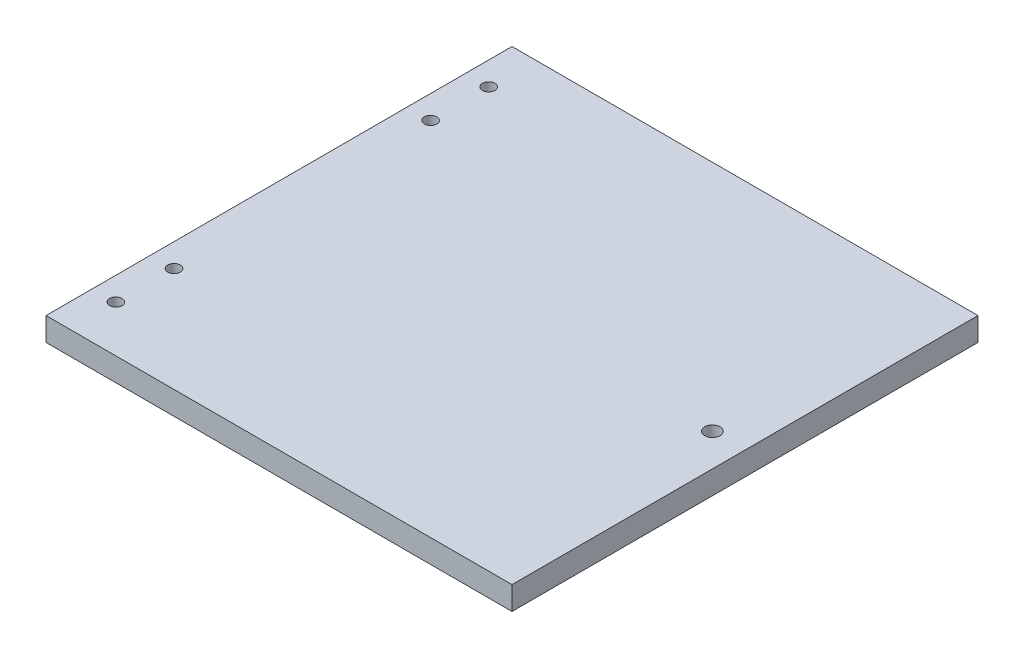
ISO-10303-21;
HEADER;
FILE_DESCRIPTION(('STEP AP214'),'2;1');
FILE_NAME('part.step','',(''),(''),'','','');
FILE_SCHEMA(('AUTOMOTIVE_DESIGN { 1 0 10303 214 1 1 1 1 }'));
ENDSEC;
DATA;
#1=APPLICATION_CONTEXT('core data for automotive mechanical design processes');
#2=APPLICATION_PROTOCOL_DEFINITION('international standard','automotive_design',2000,#1);
#3=PRODUCT_CONTEXT('',#1,'mechanical');
#4=PRODUCT('Part','Part','',(#3));
#5=PRODUCT_RELATED_PRODUCT_CATEGORY('part','',(#4));
#6=PRODUCT_DEFINITION_FORMATION('','',#4);
#7=PRODUCT_DEFINITION_CONTEXT('part definition',#1,'design');
#8=PRODUCT_DEFINITION('design','',#6,#7);
#9=PRODUCT_DEFINITION_SHAPE('','',#8);
#10=(LENGTH_UNIT() NAMED_UNIT(*) SI_UNIT(.MILLI.,.METRE.));
#11=(NAMED_UNIT(*) PLANE_ANGLE_UNIT() SI_UNIT($,.RADIAN.));
#12=(NAMED_UNIT(*) SI_UNIT($,.STERADIAN.) SOLID_ANGLE_UNIT());
#13=UNCERTAINTY_MEASURE_WITH_UNIT(LENGTH_MEASURE(1.E-05),#10,'distance_accuracy_value','');
#14=(GEOMETRIC_REPRESENTATION_CONTEXT(3) GLOBAL_UNCERTAINTY_ASSIGNED_CONTEXT((#13)) GLOBAL_UNIT_ASSIGNED_CONTEXT((#10,
#11,#12)) REPRESENTATION_CONTEXT('',''));
#15=CARTESIAN_POINT('',(0.,0.,0.));
#16=DIRECTION('',(0.,0.,1.));
#17=DIRECTION('',(1.,0.,0.));
#18=AXIS2_PLACEMENT_3D('',#15,#16,#17);
#19=CARTESIAN_POINT('',(0.,6.35,0.));
#20=DIRECTION('',(0.,1.,0.));
#21=DIRECTION('',(0.,0.,1.));
#22=AXIS2_PLACEMENT_3D('',#19,#20,#21);
#23=PLANE('',#22);
#24=CARTESIAN_POINT('',(-86.9399852969315,6.35,62.3057339449541));
#25=DIRECTION('',(0.,1.,0.));
#26=DIRECTION('',(0.,0.,1.));
#27=AXIS2_PLACEMENT_3D('',#24,#25,#26);
#28=CIRCLE('',#27,1.70180000000001);
#29=CARTESIAN_POINT('',(-86.9399852969315,6.35,64.0075339449541));
#30=VERTEX_POINT('',#29);
#31=EDGE_CURVE('E127',#30,#30,#28,.T.);
#32=ORIENTED_EDGE('',*,*,#31,.F.);
#33=EDGE_LOOP('',(#32));
#34=FACE_BOUND('',#33,.T.);
#35=CARTESIAN_POINT('',(-86.9399852969315,6.35,-23.4573660550459));
#36=DIRECTION('',(0.,1.,0.));
#37=DIRECTION('',(0.,0.,1.));
#38=AXIS2_PLACEMENT_3D('',#35,#36,#37);
#39=CIRCLE('',#38,1.70180000000001);
#40=CARTESIAN_POINT('',(-86.9399852969315,6.35,-21.7555660550459));
#41=VERTEX_POINT('',#40);
#42=EDGE_CURVE('E115',#41,#41,#39,.T.);
#43=ORIENTED_EDGE('',*,*,#42,.F.);
#44=EDGE_LOOP('',(#43));
#45=FACE_BOUND('',#44,.T.);
#46=DIRECTION('',(0.,0.,1.));
#47=VECTOR('',#46,1.);
#48=CARTESIAN_POINT('',(-93.2899852969315,6.35,-51.9942660550459));
#49=LINE('',#48,#47);
#50=CARTESIAN_POINT('',(-93.2899852969315,6.35,-51.9942660550459));
#51=VERTEX_POINT('',#50);
#52=CARTESIAN_POINT('',(-93.2899852969314,6.35,75.0057339449541));
#53=VERTEX_POINT('',#52);
#54=EDGE_CURVE('E85',#51,#53,#49,.T.);
#55=ORIENTED_EDGE('',*,*,#54,.T.);
#56=DIRECTION('',(1.,0.,0.));
#57=VECTOR('',#56,1.);
#58=CARTESIAN_POINT('',(-93.2899852969314,6.35,75.0057339449541));
#59=LINE('',#58,#57);
#60=CARTESIAN_POINT('',(33.7100147030686,6.35,75.0057339449541));
#61=VERTEX_POINT('',#60);
#62=EDGE_CURVE('E80',#53,#61,#59,.T.);
#63=ORIENTED_EDGE('',*,*,#62,.T.);
#64=DIRECTION('',(0.,0.,-1.));
#65=VECTOR('',#64,1.);
#66=CARTESIAN_POINT('',(33.7100147030685,6.35,-51.9942660550459));
#67=LINE('',#66,#65);
#68=CARTESIAN_POINT('',(33.7100147030685,6.35,-51.9942660550459));
#69=VERTEX_POINT('',#68);
#70=EDGE_CURVE('E83',#61,#69,#67,.T.);
#71=ORIENTED_EDGE('',*,*,#70,.T.);
#72=DIRECTION('',(-1.,0.,0.));
#73=VECTOR('',#72,1.);
#74=CARTESIAN_POINT('',(-93.2899852969315,6.35,-51.9942660550459));
#75=LINE('',#74,#73);
#76=EDGE_CURVE('E50',#69,#51,#75,.T.);
#77=ORIENTED_EDGE('',*,*,#76,.T.);
#78=EDGE_LOOP('',(#55,#63,#71,#77));
#79=FACE_BOUND('',#78,.T.);
#80=CARTESIAN_POINT('',(24.8200147030686,6.35,11.5057339449541));
#81=DIRECTION('',(0.,1.,0.));
#82=DIRECTION('',(0.,0.,1.));
#83=AXIS2_PLACEMENT_3D('',#80,#81,#82);
#84=CIRCLE('',#83,2.10185);
#85=CARTESIAN_POINT('',(24.8200147030686,6.35,13.6075839449541));
#86=VERTEX_POINT('',#85);
#87=EDGE_CURVE('E100',#86,#86,#84,.T.);
#88=ORIENTED_EDGE('',*,*,#87,.F.);
#89=EDGE_LOOP('',(#88));
#90=FACE_BOUND('',#89,.T.);
#91=CARTESIAN_POINT('',(-86.9399852969315,6.35,-39.2942660550459));
#92=DIRECTION('',(0.,1.,0.));
#93=DIRECTION('',(0.,0.,1.));
#94=AXIS2_PLACEMENT_3D('',#91,#92,#93);
#95=CIRCLE('',#94,1.7018);
#96=CARTESIAN_POINT('',(-86.9399852969315,6.35,-37.5924660550459));
#97=VERTEX_POINT('',#96);
#98=EDGE_CURVE('E121',#97,#97,#95,.T.);
#99=ORIENTED_EDGE('',*,*,#98,.F.);
#100=EDGE_LOOP('',(#99));
#101=FACE_BOUND('',#100,.T.);
#102=CARTESIAN_POINT('',(-86.9399852969315,6.35,46.4688339449541));
#103=DIRECTION('',(0.,1.,0.));
#104=DIRECTION('',(0.,0.,1.));
#105=AXIS2_PLACEMENT_3D('',#102,#103,#104);
#106=CIRCLE('',#105,1.7018);
#107=CARTESIAN_POINT('',(-86.9399852969315,6.35,48.1706339449541));
#108=VERTEX_POINT('',#107);
#109=EDGE_CURVE('E133',#108,#108,#106,.T.);
#110=ORIENTED_EDGE('',*,*,#109,.F.);
#111=EDGE_LOOP('',(#110));
#112=FACE_BOUND('',#111,.T.);
#113=ADVANCED_FACE('F33',(#34,#45,#79,#90,#101,#112),#23,.T.);
#114=CARTESIAN_POINT('',(0.,0.,0.));
#115=DIRECTION('',(0.,1.,0.));
#116=DIRECTION('',(0.,0.,1.));
#117=AXIS2_PLACEMENT_3D('',#114,#115,#116);
#118=PLANE('',#117);
#119=DIRECTION('',(0.,0.,1.));
#120=VECTOR('',#119,1.);
#121=CARTESIAN_POINT('',(-93.2899852969315,0.,-51.9942660550459));
#122=LINE('',#121,#120);
#123=CARTESIAN_POINT('',(-93.2899852969315,0.,-51.9942660550459));
#124=VERTEX_POINT('',#123);
#125=CARTESIAN_POINT('',(-93.2899852969314,0.,75.0057339449541));
#126=VERTEX_POINT('',#125);
#127=EDGE_CURVE('E97',#124,#126,#122,.T.);
#128=ORIENTED_EDGE('',*,*,#127,.F.);
#129=DIRECTION('',(-1.,0.,0.));
#130=VECTOR('',#129,1.);
#131=CARTESIAN_POINT('',(-93.2899852969315,0.,-51.9942660550459));
#132=LINE('',#131,#130);
#133=CARTESIAN_POINT('',(33.7100147030685,0.,-51.9942660550459));
#134=VERTEX_POINT('',#133);
#135=EDGE_CURVE('E73',#134,#124,#132,.T.);
#136=ORIENTED_EDGE('',*,*,#135,.F.);
#137=DIRECTION('',(0.,0.,-1.));
#138=VECTOR('',#137,1.);
#139=CARTESIAN_POINT('',(33.7100147030685,0.,-51.9942660550459));
#140=LINE('',#139,#138);
#141=CARTESIAN_POINT('',(33.7100147030686,0.,75.0057339449541));
#142=VERTEX_POINT('',#141);
#143=EDGE_CURVE('E67',#142,#134,#140,.T.);
#144=ORIENTED_EDGE('',*,*,#143,.F.);
#145=DIRECTION('',(1.,0.,0.));
#146=VECTOR('',#145,1.);
#147=CARTESIAN_POINT('',(-93.2899852969314,0.,75.0057339449541));
#148=LINE('',#147,#146);
#149=EDGE_CURVE('E89',#126,#142,#148,.T.);
#150=ORIENTED_EDGE('',*,*,#149,.F.);
#151=EDGE_LOOP('',(#128,#136,#144,#150));
#152=FACE_BOUND('',#151,.T.);
#153=CARTESIAN_POINT('',(24.8200147030686,0.,11.5057339449541));
#154=DIRECTION('',(0.,1.,0.));
#155=DIRECTION('',(0.,0.,1.));
#156=AXIS2_PLACEMENT_3D('',#153,#154,#155);
#157=CIRCLE('',#156,2.10185);
#158=CARTESIAN_POINT('',(24.8200147030686,0.,13.6075839449541));
#159=VERTEX_POINT('',#158);
#160=EDGE_CURVE('E112',#159,#159,#157,.T.);
#161=ORIENTED_EDGE('',*,*,#160,.T.);
#162=EDGE_LOOP('',(#161));
#163=FACE_BOUND('',#162,.T.);
#164=CARTESIAN_POINT('',(-86.9399852969315,0.,-23.4573660550459));
#165=DIRECTION('',(0.,1.,0.));
#166=DIRECTION('',(0.,0.,1.));
#167=AXIS2_PLACEMENT_3D('',#164,#165,#166);
#168=CIRCLE('',#167,1.70180000000001);
#169=CARTESIAN_POINT('',(-86.9399852969315,0.,-21.7555660550459));
#170=VERTEX_POINT('',#169);
#171=EDGE_CURVE('E118',#170,#170,#168,.T.);
#172=ORIENTED_EDGE('',*,*,#171,.T.);
#173=EDGE_LOOP('',(#172));
#174=FACE_BOUND('',#173,.T.);
#175=CARTESIAN_POINT('',(-86.9399852969315,0.,-39.2942660550459));
#176=DIRECTION('',(0.,1.,0.));
#177=DIRECTION('',(0.,0.,1.));
#178=AXIS2_PLACEMENT_3D('',#175,#176,#177);
#179=CIRCLE('',#178,1.7018);
#180=CARTESIAN_POINT('',(-86.9399852969315,0.,-37.5924660550459));
#181=VERTEX_POINT('',#180);
#182=EDGE_CURVE('E124',#181,#181,#179,.T.);
#183=ORIENTED_EDGE('',*,*,#182,.T.);
#184=EDGE_LOOP('',(#183));
#185=FACE_BOUND('',#184,.T.);
#186=CARTESIAN_POINT('',(-86.9399852969315,0.,62.3057339449541));
#187=DIRECTION('',(0.,1.,0.));
#188=DIRECTION('',(0.,0.,1.));
#189=AXIS2_PLACEMENT_3D('',#186,#187,#188);
#190=CIRCLE('',#189,1.70180000000001);
#191=CARTESIAN_POINT('',(-86.9399852969315,0.,64.0075339449541));
#192=VERTEX_POINT('',#191);
#193=EDGE_CURVE('E130',#192,#192,#190,.T.);
#194=ORIENTED_EDGE('',*,*,#193,.T.);
#195=EDGE_LOOP('',(#194));
#196=FACE_BOUND('',#195,.T.);
#197=CARTESIAN_POINT('',(-86.9399852969315,0.,46.4688339449541));
#198=DIRECTION('',(0.,1.,0.));
#199=DIRECTION('',(0.,0.,1.));
#200=AXIS2_PLACEMENT_3D('',#197,#198,#199);
#201=CIRCLE('',#200,1.7018);
#202=CARTESIAN_POINT('',(-86.9399852969315,0.,48.1706339449541));
#203=VERTEX_POINT('',#202);
#204=EDGE_CURVE('E136',#203,#203,#201,.T.);
#205=ORIENTED_EDGE('',*,*,#204,.T.);
#206=EDGE_LOOP('',(#205));
#207=FACE_BOUND('',#206,.T.);
#208=ADVANCED_FACE('F108',(#152,#163,#174,#185,#196,#207),#118,.F.);
#209=CARTESIAN_POINT('',(-93.2899852969315,6.35,-51.9942660550459));
#210=DIRECTION('',(1.,0.,0.));
#211=DIRECTION('',(0.,0.,-1.));
#212=AXIS2_PLACEMENT_3D('',#209,#210,#211);
#213=PLANE('',#212);
#214=ORIENTED_EDGE('',*,*,#127,.T.);
#215=DIRECTION('',(0.,-1.,0.));
#216=VECTOR('',#215,1.);
#217=CARTESIAN_POINT('',(-93.2899852969314,6.35,75.0057339449541));
#218=LINE('',#217,#216);
#219=EDGE_CURVE('E11',#53,#126,#218,.T.);
#220=ORIENTED_EDGE('',*,*,#219,.F.);
#221=ORIENTED_EDGE('',*,*,#54,.F.);
#222=DIRECTION('',(0.,-1.,0.));
#223=VECTOR('',#222,1.);
#224=CARTESIAN_POINT('',(-93.2899852969315,6.35,-51.9942660550459));
#225=LINE('',#224,#223);
#226=EDGE_CURVE('E93',#51,#124,#225,.T.);
#227=ORIENTED_EDGE('',*,*,#226,.T.);
#228=EDGE_LOOP('',(#214,#220,#221,#227));
#229=FACE_BOUND('',#228,.T.);
#230=ADVANCED_FACE('F35',(#229),#213,.F.);
#231=CARTESIAN_POINT('',(-93.2899852969314,6.35,75.0057339449541));
#232=DIRECTION('',(0.,0.,-1.));
#233=DIRECTION('',(-1.,0.,0.));
#234=AXIS2_PLACEMENT_3D('',#231,#232,#233);
#235=PLANE('',#234);
#236=ORIENTED_EDGE('',*,*,#149,.T.);
#237=DIRECTION('',(0.,-1.,0.));
#238=VECTOR('',#237,1.);
#239=CARTESIAN_POINT('',(33.7100147030686,6.35,75.0057339449541));
#240=LINE('',#239,#238);
#241=EDGE_CURVE('E42',#61,#142,#240,.T.);
#242=ORIENTED_EDGE('',*,*,#241,.F.);
#243=ORIENTED_EDGE('',*,*,#62,.F.);
#244=ORIENTED_EDGE('',*,*,#219,.T.);
#245=EDGE_LOOP('',(#236,#242,#243,#244));
#246=FACE_BOUND('',#245,.T.);
#247=ADVANCED_FACE('F88',(#246),#235,.F.);
#248=CARTESIAN_POINT('',(33.7100147030685,6.35,-51.9942660550459));
#249=DIRECTION('',(-1.,0.,0.));
#250=DIRECTION('',(0.,0.,1.));
#251=AXIS2_PLACEMENT_3D('',#248,#249,#250);
#252=PLANE('',#251);
#253=ORIENTED_EDGE('',*,*,#143,.T.);
#254=DIRECTION('',(0.,-1.,0.));
#255=VECTOR('',#254,1.);
#256=CARTESIAN_POINT('',(33.7100147030685,6.35,-51.9942660550459));
#257=LINE('',#256,#255);
#258=EDGE_CURVE('E90',#69,#134,#257,.T.);
#259=ORIENTED_EDGE('',*,*,#258,.F.);
#260=ORIENTED_EDGE('',*,*,#70,.F.);
#261=ORIENTED_EDGE('',*,*,#241,.T.);
#262=EDGE_LOOP('',(#253,#259,#260,#261));
#263=FACE_BOUND('',#262,.T.);
#264=ADVANCED_FACE('F91',(#263),#252,.F.);
#265=CARTESIAN_POINT('',(-93.2899852969315,6.35,-51.9942660550459));
#266=DIRECTION('',(0.,0.,1.));
#267=DIRECTION('',(1.,0.,0.));
#268=AXIS2_PLACEMENT_3D('',#265,#266,#267);
#269=PLANE('',#268);
#270=ORIENTED_EDGE('',*,*,#135,.T.);
#271=ORIENTED_EDGE('',*,*,#226,.F.);
#272=ORIENTED_EDGE('',*,*,#76,.F.);
#273=ORIENTED_EDGE('',*,*,#258,.T.);
#274=EDGE_LOOP('',(#270,#271,#272,#273));
#275=FACE_BOUND('',#274,.T.);
#276=ADVANCED_FACE('F105',(#275),#269,.F.);
#277=CARTESIAN_POINT('',(24.8200147030686,6.35,11.5057339449541));
#278=DIRECTION('',(0.,-1.,0.));
#279=DIRECTION('',(0.,0.,-1.));
#280=AXIS2_PLACEMENT_3D('',#277,#278,#279);
#281=CYLINDRICAL_SURFACE('',#280,2.10185);
#282=ORIENTED_EDGE('',*,*,#87,.T.);
#283=EDGE_LOOP('',(#282));
#284=FACE_BOUND('',#283,.T.);
#285=ORIENTED_EDGE('',*,*,#160,.F.);
#286=EDGE_LOOP('',(#285));
#287=FACE_BOUND('',#286,.T.);
#288=ADVANCED_FACE('F155',(#284,#287),#281,.F.);
#289=CARTESIAN_POINT('',(-86.9399852969315,6.35,-23.4573660550459));
#290=DIRECTION('',(0.,-1.,0.));
#291=DIRECTION('',(0.,0.,-1.));
#292=AXIS2_PLACEMENT_3D('',#289,#290,#291);
#293=CYLINDRICAL_SURFACE('',#292,1.70180000000001);
#294=ORIENTED_EDGE('',*,*,#42,.T.);
#295=EDGE_LOOP('',(#294));
#296=FACE_BOUND('',#295,.T.);
#297=ORIENTED_EDGE('',*,*,#171,.F.);
#298=EDGE_LOOP('',(#297));
#299=FACE_BOUND('',#298,.T.);
#300=ADVANCED_FACE('F201',(#296,#299),#293,.F.);
#301=CARTESIAN_POINT('',(-86.9399852969315,6.35,-39.2942660550459));
#302=DIRECTION('',(0.,-1.,0.));
#303=DIRECTION('',(0.,0.,-1.));
#304=AXIS2_PLACEMENT_3D('',#301,#302,#303);
#305=CYLINDRICAL_SURFACE('',#304,1.7018);
#306=ORIENTED_EDGE('',*,*,#98,.T.);
#307=EDGE_LOOP('',(#306));
#308=FACE_BOUND('',#307,.T.);
#309=ORIENTED_EDGE('',*,*,#182,.F.);
#310=EDGE_LOOP('',(#309));
#311=FACE_BOUND('',#310,.T.);
#312=ADVANCED_FACE('F209',(#308,#311),#305,.F.);
#313=CARTESIAN_POINT('',(-86.9399852969315,6.35,62.3057339449541));
#314=DIRECTION('',(0.,-1.,0.));
#315=DIRECTION('',(0.,0.,-1.));
#316=AXIS2_PLACEMENT_3D('',#313,#314,#315);
#317=CYLINDRICAL_SURFACE('',#316,1.70180000000001);
#318=ORIENTED_EDGE('',*,*,#31,.T.);
#319=EDGE_LOOP('',(#318));
#320=FACE_BOUND('',#319,.T.);
#321=ORIENTED_EDGE('',*,*,#193,.F.);
#322=EDGE_LOOP('',(#321));
#323=FACE_BOUND('',#322,.T.);
#324=ADVANCED_FACE('F217',(#320,#323),#317,.F.);
#325=CARTESIAN_POINT('',(-86.9399852969315,6.35,46.4688339449541));
#326=DIRECTION('',(0.,-1.,0.));
#327=DIRECTION('',(0.,0.,-1.));
#328=AXIS2_PLACEMENT_3D('',#325,#326,#327);
#329=CYLINDRICAL_SURFACE('',#328,1.7018);
#330=ORIENTED_EDGE('',*,*,#109,.T.);
#331=EDGE_LOOP('',(#330));
#332=FACE_BOUND('',#331,.T.);
#333=ORIENTED_EDGE('',*,*,#204,.F.);
#334=EDGE_LOOP('',(#333));
#335=FACE_BOUND('',#334,.T.);
#336=ADVANCED_FACE('F142',(#332,#335),#329,.F.);
#337=CLOSED_SHELL('',(#113,#208,#230,#247,#264,#276,#288,#300,#312,#324,#336));
#338=MANIFOLD_SOLID_BREP('B2',#337);
#339=ADVANCED_BREP_SHAPE_REPRESENTATION('',(#18,#338),#14);
#340=SHAPE_DEFINITION_REPRESENTATION(#9,#339);
ENDSEC;
END-ISO-10303-21;
